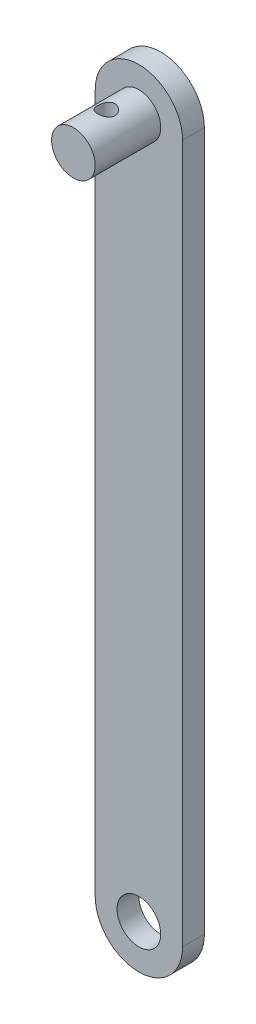
ISO-10303-21;
HEADER;
FILE_DESCRIPTION(('STEP AP214'),'2;1');
FILE_NAME('part.step','',(''),(''),'','','');
FILE_SCHEMA(('AUTOMOTIVE_DESIGN { 1 0 10303 214 1 1 1 1 }'));
ENDSEC;
DATA;
#1=APPLICATION_CONTEXT('core data for automotive mechanical design processes');
#2=APPLICATION_PROTOCOL_DEFINITION('international standard','automotive_design',2000,#1);
#3=PRODUCT_CONTEXT('',#1,'mechanical');
#4=PRODUCT('Part','Part','',(#3));
#5=PRODUCT_RELATED_PRODUCT_CATEGORY('part','',(#4));
#6=PRODUCT_DEFINITION_FORMATION('','',#4);
#7=PRODUCT_DEFINITION_CONTEXT('part definition',#1,'design');
#8=PRODUCT_DEFINITION('design','',#6,#7);
#9=PRODUCT_DEFINITION_SHAPE('','',#8);
#10=(LENGTH_UNIT() NAMED_UNIT(*) SI_UNIT(.MILLI.,.METRE.));
#11=(NAMED_UNIT(*) PLANE_ANGLE_UNIT() SI_UNIT($,.RADIAN.));
#12=(NAMED_UNIT(*) SI_UNIT($,.STERADIAN.) SOLID_ANGLE_UNIT());
#13=UNCERTAINTY_MEASURE_WITH_UNIT(LENGTH_MEASURE(1.E-05),#10,'distance_accuracy_value','');
#14=(GEOMETRIC_REPRESENTATION_CONTEXT(3) GLOBAL_UNCERTAINTY_ASSIGNED_CONTEXT((#13)) GLOBAL_UNIT_ASSIGNED_CONTEXT((#10,
#11,#12)) REPRESENTATION_CONTEXT('',''));
#15=CARTESIAN_POINT('',(0.,0.,0.));
#16=DIRECTION('',(0.,0.,1.));
#17=DIRECTION('',(1.,0.,0.));
#18=AXIS2_PLACEMENT_3D('',#15,#16,#17);
#19=CARTESIAN_POINT('',(0.,101.6,25.4));
#20=DIRECTION('',(0.,0.,-1.));
#21=DIRECTION('',(-1.,0.,0.));
#22=AXIS2_PLACEMENT_3D('',#19,#20,#21);
#23=CYLINDRICAL_SURFACE('',#22,6.35);
#24=CARTESIAN_POINT('',(0.,101.6,25.4));
#25=DIRECTION('',(0.,0.,1.));
#26=DIRECTION('',(1.,0.,0.));
#27=AXIS2_PLACEMENT_3D('',#24,#25,#26);
#28=CIRCLE('',#27,6.35);
#29=CARTESIAN_POINT('',(6.35,101.6,25.4));
#30=VERTEX_POINT('',#29);
#31=EDGE_CURVE('E168',#30,#30,#28,.T.);
#32=ORIENTED_EDGE('',*,*,#31,.F.);
#33=EDGE_LOOP('',(#32));
#34=FACE_BOUND('',#33,.T.);
#35=CARTESIAN_POINT('',(0.,101.6,6.35));
#36=DIRECTION('',(0.,0.,1.));
#37=DIRECTION('',(1.,0.,0.));
#38=AXIS2_PLACEMENT_3D('',#35,#36,#37);
#39=CIRCLE('',#38,6.35);
#40=CARTESIAN_POINT('',(6.35,101.6,6.35));
#41=VERTEX_POINT('',#40);
#42=EDGE_CURVE('E125',#41,#41,#39,.T.);
#43=ORIENTED_EDGE('',*,*,#42,.T.);
#44=EDGE_LOOP('',(#43));
#45=FACE_BOUND('',#44,.T.);
#46=CARTESIAN_POINT('',(0.,95.25,13.335));
#47=CARTESIAN_POINT('',(0.136524206735944,95.2500067537653,13.3350090967706));
#48=CARTESIAN_POINT('',(0.273271326569832,95.2544532912096,13.3460706290327));
#49=CARTESIAN_POINT('',(0.542918354048302,95.2718008185411,13.3899255020854));
#50=CARTESIAN_POINT('',(0.67580677525382,95.2847247905756,13.4227779202305));
#51=CARTESIAN_POINT('',(0.933392062216559,95.3176373635284,13.5088323741441));
#52=CARTESIAN_POINT('',(1.05811419595267,95.3376028200288,13.5619677889683));
#53=CARTESIAN_POINT('',(1.29676124667188,95.3826310910206,13.6868144158289));
#54=CARTESIAN_POINT('',(1.41068989295145,95.407692135432,13.7585191796974));
#55=CARTESIAN_POINT('',(1.63004632396242,95.4616977319217,13.9220390644513));
#56=CARTESIAN_POINT('',(1.7348990980416,95.4907628253185,14.0145854484005));
#57=CARTESIAN_POINT('',(1.92808224416796,95.5489506769739,14.2156180094426));
#58=CARTESIAN_POINT('',(2.01640453280471,95.5780734564433,14.3241119388329));
#59=CARTESIAN_POINT('',(2.17789070386169,95.6345205431251,14.5598236477725));
#60=CARTESIAN_POINT('',(2.25020502702758,95.6617071269639,14.6876598368656));
#61=CARTESIAN_POINT('',(2.37204849226828,95.7093126810088,14.9549312263771));
#62=CARTESIAN_POINT('',(2.42158845640477,95.7297348642726,15.094360880468));
#63=CARTESIAN_POINT('',(2.49415150594019,95.7602052576373,15.374254663566));
#64=CARTESIAN_POINT('',(2.51827533663395,95.770681961465,15.5143850691561));
#65=CARTESIAN_POINT('',(2.54275966122209,95.7813171485947,15.7970664478759));
#66=CARTESIAN_POINT('',(2.54313184070206,95.7814807058657,15.9396161961804));
#67=CARTESIAN_POINT('',(2.52093649674541,95.7718366464395,16.2125109727455));
#68=CARTESIAN_POINT('',(2.49996364917145,95.7627221770105,16.3430149572978));
#69=CARTESIAN_POINT('',(2.4383325379743,95.7367124173817,16.5984676361302));
#70=CARTESIAN_POINT('',(2.39767083940082,95.7198157695151,16.7234153569005));
#71=CARTESIAN_POINT('',(2.29704231034095,95.6797745393753,16.9672226519685));
#72=CARTESIAN_POINT('',(2.23669842514074,95.6565094831339,17.0859059335993));
#73=CARTESIAN_POINT('',(2.09868320512962,95.6063859218485,17.3118980867793));
#74=CARTESIAN_POINT('',(2.02100536247799,95.579526068698,17.4192026639416));
#75=CARTESIAN_POINT('',(1.84346926130722,95.5227104433731,17.6281203555785));
#76=CARTESIAN_POINT('',(1.74236057797273,95.4926758548029,17.7286522863964));
#77=CARTESIAN_POINT('',(1.52439932283632,95.4346602230298,17.9116792870626));
#78=CARTESIAN_POINT('',(1.40754362297472,95.4066795895444,17.9941707647111));
#79=CARTESIAN_POINT('',(1.15833861880942,95.3552235479402,18.1401941582181));
#80=CARTESIAN_POINT('',(1.02572882401002,95.3318480697882,18.2033192971203));
#81=CARTESIAN_POINT('',(0.750600182163255,95.2929916802248,18.3059931835691));
#82=CARTESIAN_POINT('',(0.608086409999082,95.2775067590277,18.3455539076979));
#83=CARTESIAN_POINT('',(0.326257777261934,95.2569070282622,18.397789335183));
#84=CARTESIAN_POINT('',(0.187252983361636,95.2512325879144,18.411917016902));
#85=CARTESIAN_POINT('',(-0.091243543455936,95.249130322915,18.4171756376713));
#86=CARTESIAN_POINT('',(-0.23073514079441,95.2527001015049,18.4083125375653));
#87=CARTESIAN_POINT('',(-0.499659578684899,95.2683188982903,18.368909474259));
#88=CARTESIAN_POINT('',(-0.62926276455476,95.2799797299119,18.3393613649543));
#89=CARTESIAN_POINT('',(-0.881551993637283,95.3102050941501,18.2607766504465));
#90=CARTESIAN_POINT('',(-1.0042371459859,95.3287705135721,18.2117375418208));
#91=CARTESIAN_POINT('',(-1.24343005798686,95.3717092464107,18.0939631266065));
#92=CARTESIAN_POINT('',(-1.35963408889802,95.3962428370565,18.0246712505051));
#93=CARTESIAN_POINT('',(-1.57917336088447,95.4484582677318,17.8689757886399));
#94=CARTESIAN_POINT('',(-1.68250341777165,95.4761413674995,17.7825653454885));
#95=CARTESIAN_POINT('',(-1.88051826464125,95.5339070059961,17.5883950835537));
#96=CARTESIAN_POINT('',(-1.97418189591311,95.5640272939023,17.4796024022862));
#97=CARTESIAN_POINT('',(-2.14217402073601,95.621580753952,17.2473110945791));
#98=CARTESIAN_POINT('',(-2.21649932797567,95.6490134828117,17.1238100495719));
#99=CARTESIAN_POINT('',(-2.34417552737538,95.6981283911737,16.8637436478619));
#100=CARTESIAN_POINT('',(-2.39731625476711,95.7197522877693,16.7270633209867));
#101=CARTESIAN_POINT('',(-2.47941619931716,95.7538893468242,16.4455682623354));
#102=CARTESIAN_POINT('',(-2.50839326377964,95.7664092326381,16.3007596186691));
#103=CARTESIAN_POINT('',(-2.53963883293423,95.7799486569121,16.0183475646992));
#104=CARTESIAN_POINT('',(-2.54367929088355,95.7817309532725,15.8809755535463));
#105=CARTESIAN_POINT('',(-2.52959001592309,95.7755915823034,15.6076080308743));
#106=CARTESIAN_POINT('',(-2.51146309820303,95.7676711471913,15.4716123467771));
#107=CARTESIAN_POINT('',(-2.45500062199855,95.743691556969,15.2103681182758));
#108=CARTESIAN_POINT('',(-2.41749256915668,95.7279666367898,15.0849072492419));
#109=CARTESIAN_POINT('',(-2.32410696727523,95.6903851833461,14.8420091426196));
#110=CARTESIAN_POINT('',(-2.26822434513928,95.6685269569613,14.7245741317449));
#111=CARTESIAN_POINT('',(-2.13597822075728,95.6195876619585,14.4937357747428));
#112=CARTESIAN_POINT('',(-2.05862525564912,95.5922792096984,14.3809482552866));
#113=CARTESIAN_POINT('',(-1.88708371169555,95.5362096693914,14.1693985208091));
#114=CARTESIAN_POINT('',(-1.79289005847571,95.5074481453894,14.0706405492603));
#115=CARTESIAN_POINT('',(-1.58305912509117,95.4494717580423,13.8833822423316));
#116=CARTESIAN_POINT('',(-1.46642749471675,95.4203484047761,13.7959621049299));
#117=CARTESIAN_POINT('',(-1.21908443861983,95.3668346037328,13.6419124714192));
#118=CARTESIAN_POINT('',(-1.08836650290568,95.3424463590016,13.5752926440916));
#119=CARTESIAN_POINT('',(-0.818776840744574,95.3015664698648,13.4662878940974));
#120=CARTESIAN_POINT('',(-0.680102293827397,95.2849362272416,13.4234747556515));
#121=CARTESIAN_POINT('',(-0.467940499282261,95.2668641339794,13.3774241417858));
#122=CARTESIAN_POINT('',(-0.396594153633359,95.2619869524348,13.3651050527703));
#123=CARTESIAN_POINT('',(-0.253000299869412,95.254637034718,13.3465988989027));
#124=CARTESIAN_POINT('',(-0.180753469322346,95.2521625895991,13.3404074756868));
#125=CARTESIAN_POINT('',(-0.0722838847024083,95.250307704843,13.3357700893125));
#126=CARTESIAN_POINT('',(-0.0361497567762078,95.2499982116946,13.3349975912986));
#127=CARTESIAN_POINT('',(0.,95.25,13.335));
#128=B_SPLINE_CURVE_WITH_KNOTS('',3,(#46,#47,#48,#49,#50,#51,#52,#53,#54,#55,#56,#57,#58,#59,
#60,#61,#62,#63,#64,#65,#66,#67,#68,#69,#70,#71,#72,#73,#74,#75,#76,#77,#78,#79,#80,#81,#82,#83,
#84,#85,#86,#87,#88,#89,#90,#91,#92,#93,#94,#95,#96,#97,#98,#99,#100,#101,#102,#103,#104,#105,
#106,#107,#108,#109,#110,#111,#112,#113,#114,#115,#116,#117,#118,#119,#120,#121,#122,#123,#124,
#125,#126,#127),.UNSPECIFIED.,.T.,.F.,(4,2,2,2,2,2,2,2,2,2,2,2,2,2,2,2,2,2,2,2,2,2,2,2,2,2,2,2,
2,2,2,2,2,2,2,2,2,2,2,2,4),(0.,0.4094517946242,0.820018217730078,1.22924755098891,
1.6383349703134,2.06498674759504,2.49184661566702,2.93770378700405,3.383348873602,
3.80878213742212,4.2340060905242,4.62963677069742,5.0253364981518,5.42911190399497,
5.83303915861493,6.26819103466927,6.7034294790646,7.14726679716764,7.59087834264514,
8.00822864350569,8.42547074834004,8.82396578566744,9.22251202222121,9.63324862015793,
10.0441500856369,10.48217962773,10.9202812968556,11.3626270732885,11.8046458426034,
12.2148558520879,12.6250137715507,13.0189518455694,13.4129987747255,13.82960744432,
14.2463418571246,14.6900953788797,15.1340548682348,15.5697466228691,15.7872023626933,
16.0045033235398,16.1129206008939),.UNSPECIFIED.);
#129=CARTESIAN_POINT('',(0.,95.25,13.335));
#130=VERTEX_POINT('',#129);
#131=EDGE_CURVE('E135',#130,#130,#128,.T.);
#132=ORIENTED_EDGE('',*,*,#131,.F.);
#133=EDGE_LOOP('',(#132));
#134=FACE_BOUND('',#133,.T.);
#135=CARTESIAN_POINT('',(0.,107.95,13.335));
#136=CARTESIAN_POINT('',(-0.136524206735944,107.949993246235,13.3350090967706));
#137=CARTESIAN_POINT('',(-0.273271326569831,107.94554670879,13.3460706290327));
#138=CARTESIAN_POINT('',(-0.542918354048302,107.928199181459,13.3899255020854));
#139=CARTESIAN_POINT('',(-0.675806775253819,107.915275209424,13.4227779202305));
#140=CARTESIAN_POINT('',(-0.933392062216559,107.882362636472,13.5088323741441));
#141=CARTESIAN_POINT('',(-1.05811419595267,107.862397179971,13.5619677889683));
#142=CARTESIAN_POINT('',(-1.29676124667188,107.817368908979,13.6868144158289));
#143=CARTESIAN_POINT('',(-1.41068989295145,107.792307864568,13.7585191796974));
#144=CARTESIAN_POINT('',(-1.63004632396242,107.738302268078,13.9220390644513));
#145=CARTESIAN_POINT('',(-1.7348990980416,107.709237174681,14.0145854484005));
#146=CARTESIAN_POINT('',(-1.92808224416796,107.651049323026,14.2156180094426));
#147=CARTESIAN_POINT('',(-2.01640453280471,107.621926543557,14.3241119388329));
#148=CARTESIAN_POINT('',(-2.17789070386169,107.565479456875,14.5598236477725));
#149=CARTESIAN_POINT('',(-2.25020502702758,107.538292873036,14.6876598368656));
#150=CARTESIAN_POINT('',(-2.37204849226828,107.490687318991,14.9549312263771));
#151=CARTESIAN_POINT('',(-2.42158845640477,107.470265135727,15.094360880468));
#152=CARTESIAN_POINT('',(-2.49415150594019,107.439794742363,15.374254663566));
#153=CARTESIAN_POINT('',(-2.51827533663395,107.429318038535,15.5143850691561));
#154=CARTESIAN_POINT('',(-2.54275966122209,107.418682851405,15.7970664478759));
#155=CARTESIAN_POINT('',(-2.54313184070206,107.418519294134,15.9396161961804));
#156=CARTESIAN_POINT('',(-2.52093649674541,107.42816335356,16.2125109727455));
#157=CARTESIAN_POINT('',(-2.49996364917145,107.43727782299,16.3430149572978));
#158=CARTESIAN_POINT('',(-2.4383325379743,107.463287582618,16.5984676361302));
#159=CARTESIAN_POINT('',(-2.39767083940082,107.480184230485,16.7234153569005));
#160=CARTESIAN_POINT('',(-2.29704231034095,107.520225460625,16.9672226519685));
#161=CARTESIAN_POINT('',(-2.23669842514074,107.543490516866,17.0859059335993));
#162=CARTESIAN_POINT('',(-2.09868320512962,107.593614078152,17.3118980867793));
#163=CARTESIAN_POINT('',(-2.02100536247799,107.620473931302,17.4192026639416));
#164=CARTESIAN_POINT('',(-1.84346926130722,107.677289556627,17.6281203555785));
#165=CARTESIAN_POINT('',(-1.74236057797273,107.707324145197,17.7286522863964));
#166=CARTESIAN_POINT('',(-1.52439932283632,107.76533977697,17.9116792870626));
#167=CARTESIAN_POINT('',(-1.40754362297472,107.793320410456,17.9941707647111));
#168=CARTESIAN_POINT('',(-1.15833861880943,107.84477645206,18.1401941582181));
#169=CARTESIAN_POINT('',(-1.02572882401003,107.868151930212,18.2033192971203));
#170=CARTESIAN_POINT('',(-0.750600182163258,107.907008319775,18.3059931835691));
#171=CARTESIAN_POINT('',(-0.608086409999084,107.922493240972,18.3455539076979));
#172=CARTESIAN_POINT('',(-0.326257777261934,107.943092971738,18.397789335183));
#173=CARTESIAN_POINT('',(-0.187252983361636,107.948767412086,18.411917016902));
#174=CARTESIAN_POINT('',(0.091243543455936,107.950869677085,18.4171756376713));
#175=CARTESIAN_POINT('',(0.23073514079441,107.947299898495,18.4083125375653));
#176=CARTESIAN_POINT('',(0.499659578684899,107.93168110171,18.368909474259));
#177=CARTESIAN_POINT('',(0.62926276455476,107.920020270088,18.3393613649543));
#178=CARTESIAN_POINT('',(0.881551993637283,107.88979490585,18.2607766504465));
#179=CARTESIAN_POINT('',(1.0042371459859,107.871229486428,18.2117375418208));
#180=CARTESIAN_POINT('',(1.24343005798685,107.828290753589,18.0939631266065));
#181=CARTESIAN_POINT('',(1.35963408889802,107.803757162943,18.0246712505051));
#182=CARTESIAN_POINT('',(1.57917336088446,107.751541732268,17.8689757886399));
#183=CARTESIAN_POINT('',(1.68250341777165,107.723858632501,17.7825653454885));
#184=CARTESIAN_POINT('',(1.88051826464125,107.666092994004,17.5883950835537));
#185=CARTESIAN_POINT('',(1.97418189591311,107.635972706098,17.4796024022862));
#186=CARTESIAN_POINT('',(2.14217402073601,107.578419246048,17.2473110945791));
#187=CARTESIAN_POINT('',(2.21649932797567,107.550986517188,17.1238100495719));
#188=CARTESIAN_POINT('',(2.34417552737538,107.501871608826,16.8637436478619));
#189=CARTESIAN_POINT('',(2.39731625476711,107.480247712231,16.7270633209867));
#190=CARTESIAN_POINT('',(2.47941619931716,107.446110653176,16.4455682623354));
#191=CARTESIAN_POINT('',(2.50839326377964,107.433590767362,16.3007596186691));
#192=CARTESIAN_POINT('',(2.53963883293423,107.420051343088,16.0183475646992));
#193=CARTESIAN_POINT('',(2.54367929088355,107.418269046728,15.8809755535463));
#194=CARTESIAN_POINT('',(2.52959001592309,107.424408417697,15.6076080308743));
#195=CARTESIAN_POINT('',(2.51146309820303,107.432328852809,15.4716123467771));
#196=CARTESIAN_POINT('',(2.45500062199855,107.456308443031,15.2103681182758));
#197=CARTESIAN_POINT('',(2.41749256915668,107.47203336321,15.0849072492419));
#198=CARTESIAN_POINT('',(2.32410696727523,107.509614816654,14.8420091426196));
#199=CARTESIAN_POINT('',(2.26822434513928,107.531473043039,14.7245741317449));
#200=CARTESIAN_POINT('',(2.13597822075728,107.580412338041,14.4937357747428));
#201=CARTESIAN_POINT('',(2.05862525564912,107.607720790302,14.3809482552866));
#202=CARTESIAN_POINT('',(1.88708371169555,107.663790330609,14.1693985208091));
#203=CARTESIAN_POINT('',(1.79289005847571,107.692551854611,14.0706405492603));
#204=CARTESIAN_POINT('',(1.58305912509117,107.750528241958,13.8833822423316));
#205=CARTESIAN_POINT('',(1.46642749471675,107.779651595224,13.7959621049299));
#206=CARTESIAN_POINT('',(1.21908443861983,107.833165396267,13.6419124714192));
#207=CARTESIAN_POINT('',(1.08836650290568,107.857553640998,13.5752926440916));
#208=CARTESIAN_POINT('',(0.818776840744574,107.898433530135,13.4662878940974));
#209=CARTESIAN_POINT('',(0.680102293827398,107.915063772758,13.4234747556515));
#210=CARTESIAN_POINT('',(0.467940499282261,107.933135866021,13.3774241417858));
#211=CARTESIAN_POINT('',(0.396594153633358,107.938013047565,13.3651050527703));
#212=CARTESIAN_POINT('',(0.253000299869411,107.945362965282,13.3465988989027));
#213=CARTESIAN_POINT('',(0.180753469322345,107.947837410401,13.3404074756868));
#214=CARTESIAN_POINT('',(0.0722838847024083,107.949692295157,13.3357700893125));
#215=CARTESIAN_POINT('',(0.0361497567762078,107.950001788305,13.3349975912986));
#216=CARTESIAN_POINT('',(0.,107.95,13.335));
#217=B_SPLINE_CURVE_WITH_KNOTS('',3,(#135,#136,#137,#138,#139,#140,#141,#142,#143,#144,#145,
#146,#147,#148,#149,#150,#151,#152,#153,#154,#155,#156,#157,#158,#159,#160,#161,#162,#163,#164,
#165,#166,#167,#168,#169,#170,#171,#172,#173,#174,#175,#176,#177,#178,#179,#180,#181,#182,#183,
#184,#185,#186,#187,#188,#189,#190,#191,#192,#193,#194,#195,#196,#197,#198,#199,#200,#201,#202,
#203,#204,#205,#206,#207,#208,#209,#210,#211,#212,#213,#214,#215,#216),.UNSPECIFIED.,.T.,.F.,(4,
2,2,2,2,2,2,2,2,2,2,2,2,2,2,2,2,2,2,2,2,2,2,2,2,2,2,2,2,2,2,2,2,2,2,2,2,2,2,2,4),(0.,
0.409451794624199,0.820018217730078,1.22924755098891,1.6383349703134,2.06498674759504,
2.49184661566702,2.93770378700405,3.383348873602,3.80878213742212,4.2340060905242,
4.62963677069742,5.0253364981518,5.42911190399497,5.83303915861493,6.26819103466927,
6.7034294790646,7.14726679716764,7.59087834264514,8.00822864350569,8.42547074834004,
8.82396578566744,9.22251202222121,9.63324862015792,10.0441500856369,10.48217962773,
10.9202812968556,11.3626270732885,11.8046458426034,12.2148558520879,12.6250137715507,
13.0189518455694,13.4129987747255,13.82960744432,14.2463418571246,14.6900953788797,
15.1340548682348,15.5697466228691,15.7872023626933,16.0045033235398,16.1129206008939),.UNSPECIFIED.);
#218=CARTESIAN_POINT('',(0.,107.95,13.335));
#219=VERTEX_POINT('',#218);
#220=EDGE_CURVE('E47',#219,#219,#217,.T.);
#221=ORIENTED_EDGE('',*,*,#220,.F.);
#222=EDGE_LOOP('',(#221));
#223=FACE_BOUND('',#222,.T.);
#224=ADVANCED_FACE('F43',(#34,#45,#134,#223),#23,.T.);
#225=CARTESIAN_POINT('',(0.,101.6,6.35));
#226=DIRECTION('',(0.,0.,-1.));
#227=DIRECTION('',(-1.,0.,0.));
#228=AXIS2_PLACEMENT_3D('',#225,#226,#227);
#229=PLANE('',#228);
#230=CARTESIAN_POINT('',(0.,101.6,6.35));
#231=DIRECTION('',(0.,0.,1.));
#232=DIRECTION('',(-1.,0.,0.));
#233=AXIS2_PLACEMENT_3D('',#230,#231,#232);
#234=CIRCLE('',#233,12.7);
#235=CARTESIAN_POINT('',(12.7,101.6,6.35));
#236=VERTEX_POINT('',#235);
#237=CARTESIAN_POINT('',(-12.7,101.6,6.35));
#238=VERTEX_POINT('',#237);
#239=EDGE_CURVE('E104',#236,#238,#234,.T.);
#240=ORIENTED_EDGE('',*,*,#239,.T.);
#241=DIRECTION('',(0.,-1.,0.));
#242=VECTOR('',#241,1.);
#243=CARTESIAN_POINT('',(-12.7,-101.6,6.35));
#244=LINE('',#243,#242);
#245=CARTESIAN_POINT('',(-12.7,-101.6,6.35));
#246=VERTEX_POINT('',#245);
#247=EDGE_CURVE('E98',#238,#246,#244,.T.);
#248=ORIENTED_EDGE('',*,*,#247,.T.);
#249=CARTESIAN_POINT('',(0.,-101.6,6.35));
#250=DIRECTION('',(0.,0.,1.));
#251=DIRECTION('',(1.,0.,0.));
#252=AXIS2_PLACEMENT_3D('',#249,#250,#251);
#253=CIRCLE('',#252,12.7);
#254=CARTESIAN_POINT('',(12.7,-101.6,6.35));
#255=VERTEX_POINT('',#254);
#256=EDGE_CURVE('E102',#246,#255,#253,.T.);
#257=ORIENTED_EDGE('',*,*,#256,.T.);
#258=DIRECTION('',(0.,1.,0.));
#259=VECTOR('',#258,1.);
#260=CARTESIAN_POINT('',(12.7,-101.6,6.35));
#261=LINE('',#260,#259);
#262=EDGE_CURVE('E68',#255,#236,#261,.T.);
#263=ORIENTED_EDGE('',*,*,#262,.T.);
#264=EDGE_LOOP('',(#240,#248,#257,#263));
#265=FACE_BOUND('',#264,.T.);
#266=ORIENTED_EDGE('',*,*,#42,.F.);
#267=EDGE_LOOP('',(#266));
#268=FACE_BOUND('',#267,.T.);
#269=CARTESIAN_POINT('',(0.,-101.6,6.35));
#270=DIRECTION('',(0.,0.,1.));
#271=DIRECTION('',(-1.,0.,0.));
#272=AXIS2_PLACEMENT_3D('',#269,#270,#271);
#273=CIRCLE('',#272,6.35);
#274=CARTESIAN_POINT('',(-6.35,-101.6,6.35));
#275=VERTEX_POINT('',#274);
#276=EDGE_CURVE('E183',#275,#275,#273,.T.);
#277=ORIENTED_EDGE('',*,*,#276,.F.);
#278=EDGE_LOOP('',(#277));
#279=FACE_BOUND('',#278,.T.);
#280=ADVANCED_FACE('F99',(#265,#268,#279),#229,.F.);
#281=CARTESIAN_POINT('',(0.,101.6,0.));
#282=DIRECTION('',(0.,0.,-1.));
#283=DIRECTION('',(-1.,0.,0.));
#284=AXIS2_PLACEMENT_3D('',#281,#282,#283);
#285=PLANE('',#284);
#286=CARTESIAN_POINT('',(0.,101.6,0.));
#287=DIRECTION('',(0.,0.,1.));
#288=DIRECTION('',(-1.,0.,0.));
#289=AXIS2_PLACEMENT_3D('',#286,#287,#288);
#290=CIRCLE('',#289,12.7);
#291=CARTESIAN_POINT('',(12.7,101.6,0.));
#292=VERTEX_POINT('',#291);
#293=CARTESIAN_POINT('',(-12.7,101.6,0.));
#294=VERTEX_POINT('',#293);
#295=EDGE_CURVE('E121',#292,#294,#290,.T.);
#296=ORIENTED_EDGE('',*,*,#295,.F.);
#297=DIRECTION('',(0.,1.,0.));
#298=VECTOR('',#297,1.);
#299=CARTESIAN_POINT('',(12.7,-101.6,0.));
#300=LINE('',#299,#298);
#301=CARTESIAN_POINT('',(12.7,-101.6,0.));
#302=VERTEX_POINT('',#301);
#303=EDGE_CURVE('E91',#302,#292,#300,.T.);
#304=ORIENTED_EDGE('',*,*,#303,.F.);
#305=CARTESIAN_POINT('',(0.,-101.6,0.));
#306=DIRECTION('',(0.,0.,1.));
#307=DIRECTION('',(1.,0.,0.));
#308=AXIS2_PLACEMENT_3D('',#305,#306,#307);
#309=CIRCLE('',#308,12.7);
#310=CARTESIAN_POINT('',(-12.7,-101.6,0.));
#311=VERTEX_POINT('',#310);
#312=EDGE_CURVE('E85',#311,#302,#309,.T.);
#313=ORIENTED_EDGE('',*,*,#312,.F.);
#314=DIRECTION('',(0.,-1.,0.));
#315=VECTOR('',#314,1.);
#316=CARTESIAN_POINT('',(-12.7,-101.6,0.));
#317=LINE('',#316,#315);
#318=EDGE_CURVE('E109',#294,#311,#317,.T.);
#319=ORIENTED_EDGE('',*,*,#318,.F.);
#320=EDGE_LOOP('',(#296,#304,#313,#319));
#321=FACE_BOUND('',#320,.T.);
#322=CARTESIAN_POINT('',(0.,-101.6,0.));
#323=DIRECTION('',(0.,0.,1.));
#324=DIRECTION('',(-1.,0.,0.));
#325=AXIS2_PLACEMENT_3D('',#322,#323,#324);
#326=CIRCLE('',#325,6.35);
#327=CARTESIAN_POINT('',(-6.35,-101.6,0.));
#328=VERTEX_POINT('',#327);
#329=EDGE_CURVE('E179',#328,#328,#326,.T.);
#330=ORIENTED_EDGE('',*,*,#329,.T.);
#331=EDGE_LOOP('',(#330));
#332=FACE_BOUND('',#331,.T.);
#333=ADVANCED_FACE('F164',(#321,#332),#285,.T.);
#334=CARTESIAN_POINT('',(0.,101.6,6.35));
#335=DIRECTION('',(0.,0.,-1.));
#336=DIRECTION('',(-1.,0.,0.));
#337=AXIS2_PLACEMENT_3D('',#334,#335,#336);
#338=CYLINDRICAL_SURFACE('',#337,12.7);
#339=ORIENTED_EDGE('',*,*,#295,.T.);
#340=DIRECTION('',(0.,0.,-1.));
#341=VECTOR('',#340,1.);
#342=CARTESIAN_POINT('',(-12.7,101.6,6.35));
#343=LINE('',#342,#341);
#344=EDGE_CURVE('E11',#238,#294,#343,.T.);
#345=ORIENTED_EDGE('',*,*,#344,.F.);
#346=ORIENTED_EDGE('',*,*,#239,.F.);
#347=DIRECTION('',(0.,0.,-1.));
#348=VECTOR('',#347,1.);
#349=CARTESIAN_POINT('',(12.7,101.6,6.35));
#350=LINE('',#349,#348);
#351=EDGE_CURVE('E117',#236,#292,#350,.T.);
#352=ORIENTED_EDGE('',*,*,#351,.T.);
#353=EDGE_LOOP('',(#339,#345,#346,#352));
#354=FACE_BOUND('',#353,.T.);
#355=ADVANCED_FACE('F45',(#354),#338,.T.);
#356=CARTESIAN_POINT('',(-12.7,-101.6,6.35));
#357=DIRECTION('',(1.,0.,0.));
#358=DIRECTION('',(0.,0.,-1.));
#359=AXIS2_PLACEMENT_3D('',#356,#357,#358);
#360=PLANE('',#359);
#361=ORIENTED_EDGE('',*,*,#318,.T.);
#362=DIRECTION('',(0.,0.,-1.));
#363=VECTOR('',#362,1.);
#364=CARTESIAN_POINT('',(-12.7,-101.6,6.35));
#365=LINE('',#364,#363);
#366=EDGE_CURVE('E59',#246,#311,#365,.T.);
#367=ORIENTED_EDGE('',*,*,#366,.F.);
#368=ORIENTED_EDGE('',*,*,#247,.F.);
#369=ORIENTED_EDGE('',*,*,#344,.T.);
#370=EDGE_LOOP('',(#361,#367,#368,#369));
#371=FACE_BOUND('',#370,.T.);
#372=ADVANCED_FACE('F108',(#371),#360,.F.);
#373=CARTESIAN_POINT('',(0.,-101.6,6.35));
#374=DIRECTION('',(0.,0.,-1.));
#375=DIRECTION('',(-1.,0.,0.));
#376=AXIS2_PLACEMENT_3D('',#373,#374,#375);
#377=CYLINDRICAL_SURFACE('',#376,12.7);
#378=ORIENTED_EDGE('',*,*,#312,.T.);
#379=DIRECTION('',(0.,0.,-1.));
#380=VECTOR('',#379,1.);
#381=CARTESIAN_POINT('',(12.7,-101.6,6.35));
#382=LINE('',#381,#380);
#383=EDGE_CURVE('E111',#255,#302,#382,.T.);
#384=ORIENTED_EDGE('',*,*,#383,.F.);
#385=ORIENTED_EDGE('',*,*,#256,.F.);
#386=ORIENTED_EDGE('',*,*,#366,.T.);
#387=EDGE_LOOP('',(#378,#384,#385,#386));
#388=FACE_BOUND('',#387,.T.);
#389=ADVANCED_FACE('F113',(#388),#377,.T.);
#390=CARTESIAN_POINT('',(12.7,-101.6,6.35));
#391=DIRECTION('',(-1.,0.,0.));
#392=DIRECTION('',(0.,0.,1.));
#393=AXIS2_PLACEMENT_3D('',#390,#391,#392);
#394=PLANE('',#393);
#395=ORIENTED_EDGE('',*,*,#303,.T.);
#396=ORIENTED_EDGE('',*,*,#351,.F.);
#397=ORIENTED_EDGE('',*,*,#262,.F.);
#398=ORIENTED_EDGE('',*,*,#383,.T.);
#399=EDGE_LOOP('',(#395,#396,#397,#398));
#400=FACE_BOUND('',#399,.T.);
#401=ADVANCED_FACE('F156',(#400),#394,.F.);
#402=CARTESIAN_POINT('',(0.,-101.6,6.35));
#403=DIRECTION('',(0.,0.,-1.));
#404=DIRECTION('',(-1.,0.,0.));
#405=AXIS2_PLACEMENT_3D('',#402,#403,#404);
#406=CYLINDRICAL_SURFACE('',#405,6.35);
#407=ORIENTED_EDGE('',*,*,#276,.T.);
#408=EDGE_LOOP('',(#407));
#409=FACE_BOUND('',#408,.T.);
#410=ORIENTED_EDGE('',*,*,#329,.F.);
#411=EDGE_LOOP('',(#410));
#412=FACE_BOUND('',#411,.T.);
#413=ADVANCED_FACE('F151',(#409,#412),#406,.F.);
#414=CARTESIAN_POINT('',(0.,101.6,25.4));
#415=DIRECTION('',(0.,0.,1.));
#416=DIRECTION('',(1.,0.,0.));
#417=AXIS2_PLACEMENT_3D('',#414,#415,#416);
#418=PLANE('',#417);
#419=ORIENTED_EDGE('',*,*,#31,.T.);
#420=EDGE_LOOP('',(#419));
#421=FACE_BOUND('',#420,.T.);
#422=ADVANCED_FACE('F147',(#421),#418,.T.);
#423=CARTESIAN_POINT('',(0.,114.3,15.875));
#424=DIRECTION('',(0.,-1.,0.));
#425=DIRECTION('',(0.,0.,-1.));
#426=AXIS2_PLACEMENT_3D('',#423,#424,#425);
#427=CYLINDRICAL_SURFACE('',#426,2.54);
#428=ORIENTED_EDGE('',*,*,#131,.T.);
#429=EDGE_LOOP('',(#428));
#430=FACE_BOUND('',#429,.T.);
#431=ORIENTED_EDGE('',*,*,#220,.T.);
#432=EDGE_LOOP('',(#431));
#433=FACE_BOUND('',#432,.T.);
#434=ADVANCED_FACE('F144',(#430,#433),#427,.F.);
#435=CLOSED_SHELL('',(#224,#280,#333,#355,#372,#389,#401,#413,#422,#434));
#436=MANIFOLD_SOLID_BREP('B2',#435);
#437=ADVANCED_BREP_SHAPE_REPRESENTATION('',(#18,#436),#14);
#438=SHAPE_DEFINITION_REPRESENTATION(#9,#437);
ENDSEC;
END-ISO-10303-21;
